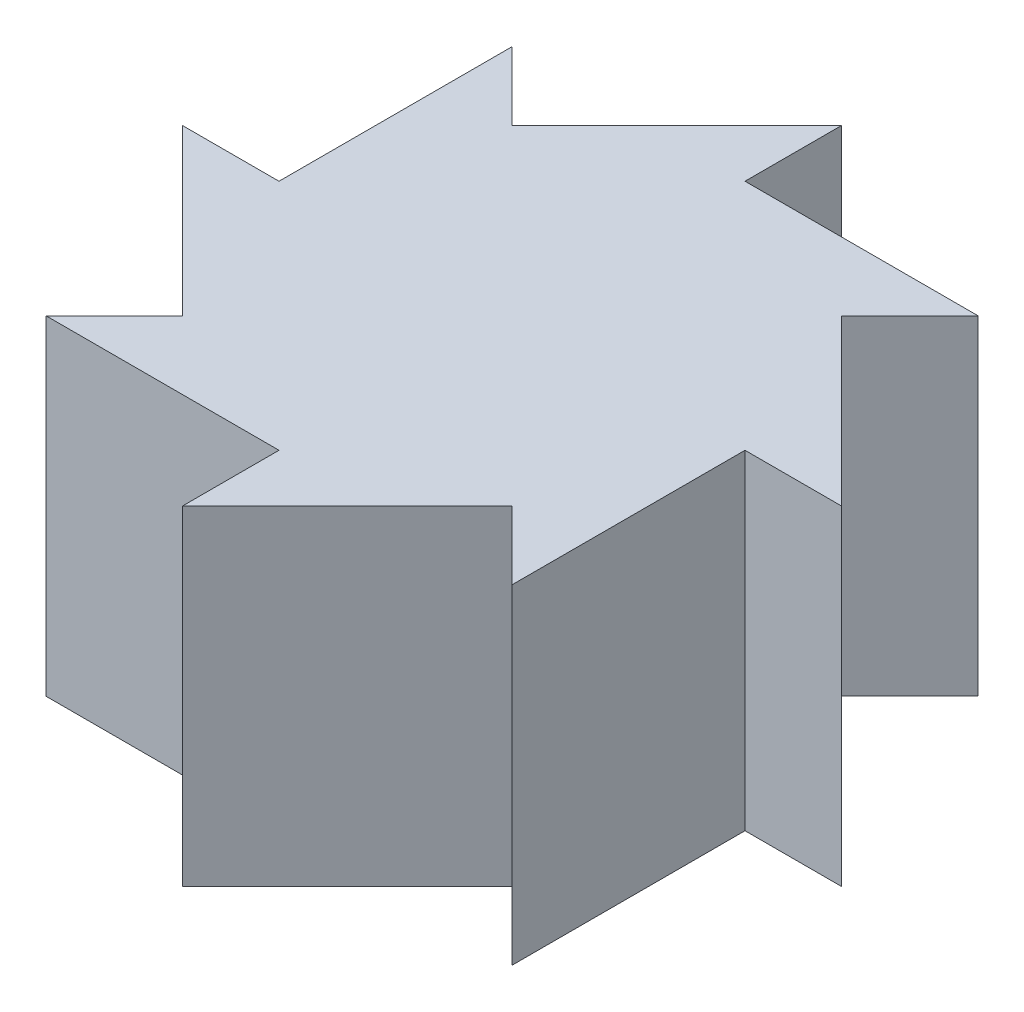
ISO-10303-21;
HEADER;
FILE_DESCRIPTION(('STEP AP214'),'2;1');
FILE_NAME('part.step','',(''),(''),'','','');
FILE_SCHEMA(('AUTOMOTIVE_DESIGN { 1 0 10303 214 1 1 1 1 }'));
ENDSEC;
DATA;
#1=APPLICATION_CONTEXT('core data for automotive mechanical design processes');
#2=APPLICATION_PROTOCOL_DEFINITION('international standard','automotive_design',2000,#1);
#3=PRODUCT_CONTEXT('',#1,'mechanical');
#4=PRODUCT('Part','Part','',(#3));
#5=PRODUCT_RELATED_PRODUCT_CATEGORY('part','',(#4));
#6=PRODUCT_DEFINITION_FORMATION('','',#4);
#7=PRODUCT_DEFINITION_CONTEXT('part definition',#1,'design');
#8=PRODUCT_DEFINITION('design','',#6,#7);
#9=PRODUCT_DEFINITION_SHAPE('','',#8);
#10=(LENGTH_UNIT() NAMED_UNIT(*) SI_UNIT(.MILLI.,.METRE.));
#11=(NAMED_UNIT(*) PLANE_ANGLE_UNIT() SI_UNIT($,.RADIAN.));
#12=(NAMED_UNIT(*) SI_UNIT($,.STERADIAN.) SOLID_ANGLE_UNIT());
#13=UNCERTAINTY_MEASURE_WITH_UNIT(LENGTH_MEASURE(1.E-05),#10,'distance_accuracy_value','');
#14=(GEOMETRIC_REPRESENTATION_CONTEXT(3) GLOBAL_UNCERTAINTY_ASSIGNED_CONTEXT((#13)) GLOBAL_UNIT_ASSIGNED_CONTEXT((#10,
#11,#12)) REPRESENTATION_CONTEXT('',''));
#15=CARTESIAN_POINT('',(0.,0.,0.));
#16=DIRECTION('',(0.,0.,1.));
#17=DIRECTION('',(1.,0.,0.));
#18=AXIS2_PLACEMENT_3D('',#15,#16,#17);
#19=CARTESIAN_POINT('',(0.,5.,0.));
#20=DIRECTION('',(0.,1.,0.));
#21=DIRECTION('',(0.,0.,1.));
#22=AXIS2_PLACEMENT_3D('',#19,#20,#21);
#23=PLANE('',#22);
#24=DIRECTION('',(0.707106781186556,0.,0.707106781186539));
#25=VECTOR('',#24,1.);
#26=CARTESIAN_POINT('',(2.5,5.,-2.50000000000006));
#27=LINE('',#26,#25);
#28=CARTESIAN_POINT('',(2.5,5.,-2.50000000000006));
#29=VERTEX_POINT('',#28);
#30=CARTESIAN_POINT('',(5.,5.,0.));
#31=VERTEX_POINT('',#30);
#32=EDGE_CURVE('E151',#29,#31,#27,.T.);
#33=ORIENTED_EDGE('',*,*,#32,.F.);
#34=DIRECTION('',(-0.707106781186539,0.,0.707106781186556));
#35=VECTOR('',#34,1.);
#36=CARTESIAN_POINT('',(3.53553390593269,5.,-3.53553390593278));
#37=LINE('',#36,#35);
#38=CARTESIAN_POINT('',(3.53553390593269,5.,-3.53553390593278));
#39=VERTEX_POINT('',#38);
#40=EDGE_CURVE('E157',#39,#29,#37,.T.);
#41=ORIENTED_EDGE('',*,*,#40,.F.);
#42=DIRECTION('',(1.,0.,0.));
#43=VECTOR('',#42,1.);
#44=CARTESIAN_POINT('',(0.,5.,-3.53553390593278));
#45=LINE('',#44,#43);
#46=CARTESIAN_POINT('',(0.,5.,-3.53553390593278));
#47=VERTEX_POINT('',#46);
#48=EDGE_CURVE('E270',#47,#39,#45,.T.);
#49=ORIENTED_EDGE('',*,*,#48,.F.);
#50=DIRECTION('',(0.,0.,1.));
#51=VECTOR('',#50,1.);
#52=CARTESIAN_POINT('',(0.,5.,-5.));
#53=LINE('',#52,#51);
#54=CARTESIAN_POINT('',(0.,5.,-5.));
#55=VERTEX_POINT('',#54);
#56=EDGE_CURVE('E264',#55,#47,#53,.T.);
#57=ORIENTED_EDGE('',*,*,#56,.F.);
#58=DIRECTION('',(0.707106781186546,0.,-0.707106781186549));
#59=VECTOR('',#58,1.);
#60=CARTESIAN_POINT('',(-2.50000000000003,5.,-2.50000000000003));
#61=LINE('',#60,#59);
#62=CARTESIAN_POINT('',(-2.50000000000003,5.,-2.50000000000003));
#63=VERTEX_POINT('',#62);
#64=EDGE_CURVE('E255',#63,#55,#61,.T.);
#65=ORIENTED_EDGE('',*,*,#64,.F.);
#66=DIRECTION('',(0.707106781186549,0.,0.707106781186547));
#67=VECTOR('',#66,1.);
#68=CARTESIAN_POINT('',(-3.53553390593274,5.,-3.53553390593273));
#69=LINE('',#68,#67);
#70=CARTESIAN_POINT('',(-3.53553390593274,5.,-3.53553390593273));
#71=VERTEX_POINT('',#70);
#72=EDGE_CURVE('E244',#71,#63,#69,.T.);
#73=ORIENTED_EDGE('',*,*,#72,.F.);
#74=DIRECTION('',(0.,0.,-1.));
#75=VECTOR('',#74,1.);
#76=CARTESIAN_POINT('',(-3.53553390593278,5.,0.));
#77=LINE('',#76,#75);
#78=CARTESIAN_POINT('',(-3.53553390593278,5.,0.));
#79=VERTEX_POINT('',#78);
#80=EDGE_CURVE('E242',#79,#71,#77,.T.);
#81=ORIENTED_EDGE('',*,*,#80,.F.);
#82=DIRECTION('',(1.,0.,0.));
#83=VECTOR('',#82,1.);
#84=CARTESIAN_POINT('',(-5.,5.,0.));
#85=LINE('',#84,#83);
#86=CARTESIAN_POINT('',(-5.,5.,0.));
#87=VERTEX_POINT('',#86);
#88=EDGE_CURVE('E240',#87,#79,#85,.T.);
#89=ORIENTED_EDGE('',*,*,#88,.F.);
#90=DIRECTION('',(-0.707106781186551,0.,-0.707106781186544));
#91=VECTOR('',#90,1.);
#92=CARTESIAN_POINT('',(-2.50000000000002,5.,2.50000000000004));
#93=LINE('',#92,#91);
#94=CARTESIAN_POINT('',(-2.50000000000002,5.,2.50000000000004));
#95=VERTEX_POINT('',#94);
#96=EDGE_CURVE('E226',#95,#87,#93,.T.);
#97=ORIENTED_EDGE('',*,*,#96,.F.);
#98=DIRECTION('',(0.707106781186544,0.,-0.707106781186551));
#99=VECTOR('',#98,1.);
#100=CARTESIAN_POINT('',(-3.53553390593272,5.,3.53553390593276));
#101=LINE('',#100,#99);
#102=CARTESIAN_POINT('',(-3.53553390593272,5.,3.53553390593276));
#103=VERTEX_POINT('',#102);
#104=EDGE_CURVE('E224',#103,#95,#101,.T.);
#105=ORIENTED_EDGE('',*,*,#104,.F.);
#106=DIRECTION('',(-1.,0.,0.));
#107=VECTOR('',#106,1.);
#108=CARTESIAN_POINT('',(0.,5.,3.53553390593278));
#109=LINE('',#108,#107);
#110=CARTESIAN_POINT('',(0.,5.,3.53553390593278));
#111=VERTEX_POINT('',#110);
#112=EDGE_CURVE('E210',#111,#103,#109,.T.);
#113=ORIENTED_EDGE('',*,*,#112,.F.);
#114=DIRECTION('',(0.,0.,-1.));
#115=VECTOR('',#114,1.);
#116=CARTESIAN_POINT('',(0.,5.,5.));
#117=LINE('',#116,#115);
#118=CARTESIAN_POINT('',(0.,5.,5.));
#119=VERTEX_POINT('',#118);
#120=EDGE_CURVE('E208',#119,#111,#117,.T.);
#121=ORIENTED_EDGE('',*,*,#120,.F.);
#122=DIRECTION('',(-0.707106781186541,0.,0.707106781186554));
#123=VECTOR('',#122,1.);
#124=CARTESIAN_POINT('',(2.50000000000005,5.,2.50000000000001));
#125=LINE('',#124,#123);
#126=CARTESIAN_POINT('',(2.50000000000005,5.,2.50000000000001));
#127=VERTEX_POINT('',#126);
#128=EDGE_CURVE('E194',#127,#119,#125,.T.);
#129=ORIENTED_EDGE('',*,*,#128,.F.);
#130=DIRECTION('',(-0.707106781186553,0.,-0.707106781186542));
#131=VECTOR('',#130,1.);
#132=CARTESIAN_POINT('',(3.53553390593277,5.,3.53553390593271));
#133=LINE('',#132,#131);
#134=CARTESIAN_POINT('',(3.53553390593277,5.,3.53553390593271));
#135=VERTEX_POINT('',#134);
#136=EDGE_CURVE('E192',#135,#127,#133,.T.);
#137=ORIENTED_EDGE('',*,*,#136,.F.);
#138=DIRECTION('',(0.,0.,1.));
#139=VECTOR('',#138,1.);
#140=CARTESIAN_POINT('',(3.53553390593278,5.,0.));
#141=LINE('',#140,#139);
#142=CARTESIAN_POINT('',(3.53553390593278,5.,0.));
#143=VERTEX_POINT('',#142);
#144=EDGE_CURVE('E179',#143,#135,#141,.T.);
#145=ORIENTED_EDGE('',*,*,#144,.F.);
#146=DIRECTION('',(-1.,0.,0.));
#147=VECTOR('',#146,1.);
#148=CARTESIAN_POINT('',(5.,5.,0.));
#149=LINE('',#148,#147);
#150=EDGE_CURVE('E168',#31,#143,#149,.T.);
#151=ORIENTED_EDGE('',*,*,#150,.F.);
#152=EDGE_LOOP('',(#33,#41,#49,#57,#65,#73,#81,#89,#97,#105,#113,#121,#129,#137,#145,#151));
#153=FACE_BOUND('',#152,.T.);
#154=ADVANCED_FACE('F35',(#153),#23,.T.);
#155=CARTESIAN_POINT('',(0.,0.,0.));
#156=DIRECTION('',(0.,1.,0.));
#157=DIRECTION('',(0.,0.,1.));
#158=AXIS2_PLACEMENT_3D('',#155,#156,#157);
#159=PLANE('',#158);
#160=DIRECTION('',(-0.707106781186539,0.,0.707106781186556));
#161=VECTOR('',#160,1.);
#162=CARTESIAN_POINT('',(3.53553390593269,0.,-3.53553390593278));
#163=LINE('',#162,#161);
#164=CARTESIAN_POINT('',(3.53553390593269,0.,-3.53553390593278));
#165=VERTEX_POINT('',#164);
#166=CARTESIAN_POINT('',(2.5,0.,-2.50000000000006));
#167=VERTEX_POINT('',#166);
#168=EDGE_CURVE('E158',#165,#167,#163,.T.);
#169=ORIENTED_EDGE('',*,*,#168,.T.);
#170=DIRECTION('',(0.707106781186556,0.,0.707106781186539));
#171=VECTOR('',#170,1.);
#172=CARTESIAN_POINT('',(2.5,0.,-2.50000000000006));
#173=LINE('',#172,#171);
#174=CARTESIAN_POINT('',(5.,0.,-1.23165366794353E-13));
#175=VERTEX_POINT('',#174);
#176=EDGE_CURVE('E154',#167,#175,#173,.T.);
#177=ORIENTED_EDGE('',*,*,#176,.T.);
#178=DIRECTION('',(-1.,0.,0.));
#179=VECTOR('',#178,1.);
#180=CARTESIAN_POINT('',(5.,0.,0.));
#181=LINE('',#180,#179);
#182=CARTESIAN_POINT('',(3.53553390593278,0.,0.));
#183=VERTEX_POINT('',#182);
#184=EDGE_CURVE('E178',#175,#183,#181,.T.);
#185=ORIENTED_EDGE('',*,*,#184,.T.);
#186=DIRECTION('',(0.,0.,1.));
#187=VECTOR('',#186,1.);
#188=CARTESIAN_POINT('',(3.53553390593278,0.,0.));
#189=LINE('',#188,#187);
#190=CARTESIAN_POINT('',(3.53553390593282,0.,3.53553390593266));
#191=VERTEX_POINT('',#190);
#192=EDGE_CURVE('E171',#183,#191,#189,.T.);
#193=ORIENTED_EDGE('',*,*,#192,.T.);
#194=DIRECTION('',(-0.707106781186553,0.,-0.707106781186542));
#195=VECTOR('',#194,1.);
#196=CARTESIAN_POINT('',(3.53553390593277,0.,3.53553390593271));
#197=LINE('',#196,#195);
#198=CARTESIAN_POINT('',(2.50000000000005,0.,2.50000000000001));
#199=VERTEX_POINT('',#198);
#200=EDGE_CURVE('E193',#191,#199,#197,.T.);
#201=ORIENTED_EDGE('',*,*,#200,.T.);
#202=DIRECTION('',(-0.707106781186541,0.,0.707106781186554));
#203=VECTOR('',#202,1.);
#204=CARTESIAN_POINT('',(2.50000000000005,0.,2.50000000000001));
#205=LINE('',#204,#203);
#206=CARTESIAN_POINT('',(1.05818132034585E-13,0.,5.));
#207=VERTEX_POINT('',#206);
#208=EDGE_CURVE('E189',#199,#207,#205,.T.);
#209=ORIENTED_EDGE('',*,*,#208,.T.);
#210=DIRECTION('',(0.,0.,-1.));
#211=VECTOR('',#210,1.);
#212=CARTESIAN_POINT('',(0.,0.,5.));
#213=LINE('',#212,#211);
#214=CARTESIAN_POINT('',(0.,0.,3.53553390593278));
#215=VERTEX_POINT('',#214);
#216=EDGE_CURVE('E209',#207,#215,#213,.T.);
#217=ORIENTED_EDGE('',*,*,#216,.T.);
#218=DIRECTION('',(-1.,0.,0.));
#219=VECTOR('',#218,1.);
#220=CARTESIAN_POINT('',(0.,0.,3.53553390593278));
#221=LINE('',#220,#219);
#222=CARTESIAN_POINT('',(-3.53553390593269,0.,3.53553390593278));
#223=VERTEX_POINT('',#222);
#224=EDGE_CURVE('E205',#215,#223,#221,.T.);
#225=ORIENTED_EDGE('',*,*,#224,.T.);
#226=DIRECTION('',(0.707106781186544,0.,-0.707106781186551));
#227=VECTOR('',#226,1.);
#228=CARTESIAN_POINT('',(-3.53553390593272,0.,3.53553390593276));
#229=LINE('',#228,#227);
#230=CARTESIAN_POINT('',(-2.50000000000002,0.,2.50000000000004));
#231=VERTEX_POINT('',#230);
#232=EDGE_CURVE('E225',#223,#231,#229,.T.);
#233=ORIENTED_EDGE('',*,*,#232,.T.);
#234=DIRECTION('',(-0.707106781186551,0.,-0.707106781186544));
#235=VECTOR('',#234,1.);
#236=CARTESIAN_POINT('',(-2.50000000000002,0.,2.50000000000004));
#237=LINE('',#236,#235);
#238=CARTESIAN_POINT('',(-5.,0.,0.));
#239=VERTEX_POINT('',#238);
#240=EDGE_CURVE('E221',#231,#239,#237,.T.);
#241=ORIENTED_EDGE('',*,*,#240,.T.);
#242=DIRECTION('',(1.,0.,0.));
#243=VECTOR('',#242,1.);
#244=CARTESIAN_POINT('',(-5.,0.,0.));
#245=LINE('',#244,#243);
#246=CARTESIAN_POINT('',(-3.53553390593278,0.,0.));
#247=VERTEX_POINT('',#246);
#248=EDGE_CURVE('E241',#239,#247,#245,.T.);
#249=ORIENTED_EDGE('',*,*,#248,.T.);
#250=DIRECTION('',(0.,0.,-1.));
#251=VECTOR('',#250,1.);
#252=CARTESIAN_POINT('',(-3.53553390593278,0.,0.));
#253=LINE('',#252,#251);
#254=CARTESIAN_POINT('',(-3.53553390593279,0.,-3.53553390593268));
#255=VERTEX_POINT('',#254);
#256=EDGE_CURVE('E237',#247,#255,#253,.T.);
#257=ORIENTED_EDGE('',*,*,#256,.T.);
#258=DIRECTION('',(0.707106781186549,0.,0.707106781186547));
#259=VECTOR('',#258,1.);
#260=CARTESIAN_POINT('',(-3.53553390593274,0.,-3.53553390593273));
#261=LINE('',#260,#259);
#262=CARTESIAN_POINT('',(-2.50000000000003,0.,-2.50000000000003));
#263=VERTEX_POINT('',#262);
#264=EDGE_CURVE('E251',#255,#263,#261,.T.);
#265=ORIENTED_EDGE('',*,*,#264,.T.);
#266=DIRECTION('',(0.707106781186546,0.,-0.707106781186549));
#267=VECTOR('',#266,1.);
#268=CARTESIAN_POINT('',(-2.50000000000003,0.,-2.50000000000003));
#269=LINE('',#268,#267);
#270=CARTESIAN_POINT('',(0.,0.,-5.));
#271=VERTEX_POINT('',#270);
#272=EDGE_CURVE('E254',#263,#271,#269,.T.);
#273=ORIENTED_EDGE('',*,*,#272,.T.);
#274=DIRECTION('',(0.,0.,1.));
#275=VECTOR('',#274,1.);
#276=CARTESIAN_POINT('',(0.,0.,-5.));
#277=LINE('',#276,#275);
#278=CARTESIAN_POINT('',(0.,0.,-3.53553390593278));
#279=VERTEX_POINT('',#278);
#280=EDGE_CURVE('E267',#271,#279,#277,.T.);
#281=ORIENTED_EDGE('',*,*,#280,.T.);
#282=DIRECTION('',(1.,0.,0.));
#283=VECTOR('',#282,1.);
#284=CARTESIAN_POINT('',(0.,0.,-3.53553390593278));
#285=LINE('',#284,#283);
#286=EDGE_CURVE('E52',#279,#165,#285,.T.);
#287=ORIENTED_EDGE('',*,*,#286,.T.);
#288=EDGE_LOOP('',(#169,#177,#185,#193,#201,#209,#217,#225,#233,#241,#249,#257,#265,#273,#281,#287));
#289=FACE_BOUND('',#288,.T.);
#290=ADVANCED_FACE('F37',(#289),#159,.F.);
#291=CARTESIAN_POINT('',(0.,0.,-3.53553390593278));
#292=DIRECTION('',(0.,0.,1.));
#293=DIRECTION('',(1.,0.,0.));
#294=AXIS2_PLACEMENT_3D('',#291,#292,#293);
#295=PLANE('',#294);
#296=ORIENTED_EDGE('',*,*,#48,.T.);
#297=DIRECTION('',(0.,1.,0.));
#298=VECTOR('',#297,1.);
#299=CARTESIAN_POINT('',(3.53553390593269,0.,-3.53553390593278));
#300=LINE('',#299,#298);
#301=EDGE_CURVE('E11',#165,#39,#300,.T.);
#302=ORIENTED_EDGE('',*,*,#301,.F.);
#303=ORIENTED_EDGE('',*,*,#286,.F.);
#304=DIRECTION('',(0.,1.,0.));
#305=VECTOR('',#304,1.);
#306=CARTESIAN_POINT('',(0.,0.,-3.53553390593278));
#307=LINE('',#306,#305);
#308=EDGE_CURVE('E44',#279,#47,#307,.T.);
#309=ORIENTED_EDGE('',*,*,#308,.T.);
#310=EDGE_LOOP('',(#296,#302,#303,#309));
#311=FACE_BOUND('',#310,.T.);
#312=ADVANCED_FACE('F282',(#311),#295,.F.);
#313=CARTESIAN_POINT('',(0.,0.,-5.));
#314=DIRECTION('',(-1.,0.,0.));
#315=DIRECTION('',(0.,0.,1.));
#316=AXIS2_PLACEMENT_3D('',#313,#314,#315);
#317=PLANE('',#316);
#318=ORIENTED_EDGE('',*,*,#56,.T.);
#319=ORIENTED_EDGE('',*,*,#308,.F.);
#320=ORIENTED_EDGE('',*,*,#280,.F.);
#321=DIRECTION('',(0.,1.,0.));
#322=VECTOR('',#321,1.);
#323=CARTESIAN_POINT('',(0.,0.,-5.));
#324=LINE('',#323,#322);
#325=EDGE_CURVE('E39',#271,#55,#324,.T.);
#326=ORIENTED_EDGE('',*,*,#325,.T.);
#327=EDGE_LOOP('',(#318,#319,#320,#326));
#328=FACE_BOUND('',#327,.T.);
#329=ADVANCED_FACE('F277',(#328),#317,.F.);
#330=CARTESIAN_POINT('',(-2.50000000000003,0.,-2.50000000000003));
#331=DIRECTION('',(0.707106781186549,0.,0.707106781186546));
#332=DIRECTION('',(0.707106781186546,0.,-0.707106781186549));
#333=AXIS2_PLACEMENT_3D('',#330,#331,#332);
#334=PLANE('',#333);
#335=ORIENTED_EDGE('',*,*,#64,.T.);
#336=ORIENTED_EDGE('',*,*,#325,.F.);
#337=ORIENTED_EDGE('',*,*,#272,.F.);
#338=DIRECTION('',(0.,1.,0.));
#339=VECTOR('',#338,1.);
#340=CARTESIAN_POINT('',(-2.50000000000003,0.,-2.50000000000003));
#341=LINE('',#340,#339);
#342=EDGE_CURVE('E262',#263,#63,#341,.T.);
#343=ORIENTED_EDGE('',*,*,#342,.T.);
#344=EDGE_LOOP('',(#335,#336,#337,#343));
#345=FACE_BOUND('',#344,.T.);
#346=ADVANCED_FACE('F285',(#345),#334,.F.);
#347=CARTESIAN_POINT('',(-3.53553390593274,0.,-3.53553390593273));
#348=DIRECTION('',(-0.707106781186547,0.,0.707106781186549));
#349=DIRECTION('',(0.707106781186549,0.,0.707106781186547));
#350=AXIS2_PLACEMENT_3D('',#347,#348,#349);
#351=PLANE('',#350);
#352=ORIENTED_EDGE('',*,*,#72,.T.);
#353=ORIENTED_EDGE('',*,*,#342,.F.);
#354=ORIENTED_EDGE('',*,*,#264,.F.);
#355=DIRECTION('',(0.,1.,0.));
#356=VECTOR('',#355,1.);
#357=CARTESIAN_POINT('',(-3.53553390593274,0.,-3.53553390593273));
#358=LINE('',#357,#356);
#359=EDGE_CURVE('E258',#255,#71,#358,.T.);
#360=ORIENTED_EDGE('',*,*,#359,.T.);
#361=EDGE_LOOP('',(#352,#353,#354,#360));
#362=FACE_BOUND('',#361,.T.);
#363=ADVANCED_FACE('F287',(#362),#351,.F.);
#364=CARTESIAN_POINT('',(-3.53553390593278,0.,0.));
#365=DIRECTION('',(1.,0.,0.));
#366=DIRECTION('',(0.,0.,-1.));
#367=AXIS2_PLACEMENT_3D('',#364,#365,#366);
#368=PLANE('',#367);
#369=ORIENTED_EDGE('',*,*,#80,.T.);
#370=ORIENTED_EDGE('',*,*,#359,.F.);
#371=ORIENTED_EDGE('',*,*,#256,.F.);
#372=DIRECTION('',(0.,1.,0.));
#373=VECTOR('',#372,1.);
#374=CARTESIAN_POINT('',(-3.53553390593278,0.,0.));
#375=LINE('',#374,#373);
#376=EDGE_CURVE('E238',#247,#79,#375,.T.);
#377=ORIENTED_EDGE('',*,*,#376,.T.);
#378=EDGE_LOOP('',(#369,#370,#371,#377));
#379=FACE_BOUND('',#378,.T.);
#380=ADVANCED_FACE('F292',(#379),#368,.F.);
#381=CARTESIAN_POINT('',(-5.,0.,0.));
#382=DIRECTION('',(0.,0.,1.));
#383=DIRECTION('',(1.,0.,0.));
#384=AXIS2_PLACEMENT_3D('',#381,#382,#383);
#385=PLANE('',#384);
#386=ORIENTED_EDGE('',*,*,#88,.T.);
#387=ORIENTED_EDGE('',*,*,#376,.F.);
#388=ORIENTED_EDGE('',*,*,#248,.F.);
#389=DIRECTION('',(0.,1.,0.));
#390=VECTOR('',#389,1.);
#391=CARTESIAN_POINT('',(-5.,0.,0.));
#392=LINE('',#391,#390);
#393=EDGE_CURVE('E228',#239,#87,#392,.T.);
#394=ORIENTED_EDGE('',*,*,#393,.T.);
#395=EDGE_LOOP('',(#386,#387,#388,#394));
#396=FACE_BOUND('',#395,.T.);
#397=ADVANCED_FACE('F296',(#396),#385,.F.);
#398=CARTESIAN_POINT('',(-2.50000000000002,0.,2.50000000000004));
#399=DIRECTION('',(0.707106781186544,0.,-0.707106781186551));
#400=DIRECTION('',(-0.707106781186551,0.,-0.707106781186544));
#401=AXIS2_PLACEMENT_3D('',#398,#399,#400);
#402=PLANE('',#401);
#403=ORIENTED_EDGE('',*,*,#96,.T.);
#404=ORIENTED_EDGE('',*,*,#393,.F.);
#405=ORIENTED_EDGE('',*,*,#240,.F.);
#406=DIRECTION('',(0.,1.,0.));
#407=VECTOR('',#406,1.);
#408=CARTESIAN_POINT('',(-2.50000000000002,0.,2.50000000000004));
#409=LINE('',#408,#407);
#410=EDGE_CURVE('E222',#231,#95,#409,.T.);
#411=ORIENTED_EDGE('',*,*,#410,.T.);
#412=EDGE_LOOP('',(#403,#404,#405,#411));
#413=FACE_BOUND('',#412,.T.);
#414=ADVANCED_FACE('F299',(#413),#402,.F.);
#415=CARTESIAN_POINT('',(-3.53553390593272,0.,3.53553390593276));
#416=DIRECTION('',(0.707106781186551,0.,0.707106781186544));
#417=DIRECTION('',(0.707106781186544,0.,-0.707106781186551));
#418=AXIS2_PLACEMENT_3D('',#415,#416,#417);
#419=PLANE('',#418);
#420=ORIENTED_EDGE('',*,*,#104,.T.);
#421=ORIENTED_EDGE('',*,*,#410,.F.);
#422=ORIENTED_EDGE('',*,*,#232,.F.);
#423=DIRECTION('',(0.,1.,0.));
#424=VECTOR('',#423,1.);
#425=CARTESIAN_POINT('',(-3.53553390593272,0.,3.53553390593276));
#426=LINE('',#425,#424);
#427=EDGE_CURVE('E212',#223,#103,#426,.T.);
#428=ORIENTED_EDGE('',*,*,#427,.T.);
#429=EDGE_LOOP('',(#420,#421,#422,#428));
#430=FACE_BOUND('',#429,.T.);
#431=ADVANCED_FACE('F303',(#430),#419,.F.);
#432=CARTESIAN_POINT('',(0.,0.,3.53553390593278));
#433=DIRECTION('',(0.,0.,-1.));
#434=DIRECTION('',(-1.,0.,0.));
#435=AXIS2_PLACEMENT_3D('',#432,#433,#434);
#436=PLANE('',#435);
#437=ORIENTED_EDGE('',*,*,#112,.T.);
#438=ORIENTED_EDGE('',*,*,#427,.F.);
#439=ORIENTED_EDGE('',*,*,#224,.F.);
#440=DIRECTION('',(0.,1.,0.));
#441=VECTOR('',#440,1.);
#442=CARTESIAN_POINT('',(0.,0.,3.53553390593278));
#443=LINE('',#442,#441);
#444=EDGE_CURVE('E206',#215,#111,#443,.T.);
#445=ORIENTED_EDGE('',*,*,#444,.T.);
#446=EDGE_LOOP('',(#437,#438,#439,#445));
#447=FACE_BOUND('',#446,.T.);
#448=ADVANCED_FACE('F309',(#447),#436,.F.);
#449=CARTESIAN_POINT('',(0.,0.,5.));
#450=DIRECTION('',(1.,0.,0.));
#451=DIRECTION('',(0.,0.,-1.));
#452=AXIS2_PLACEMENT_3D('',#449,#450,#451);
#453=PLANE('',#452);
#454=ORIENTED_EDGE('',*,*,#120,.T.);
#455=ORIENTED_EDGE('',*,*,#444,.F.);
#456=ORIENTED_EDGE('',*,*,#216,.F.);
#457=DIRECTION('',(0.,1.,0.));
#458=VECTOR('',#457,1.);
#459=CARTESIAN_POINT('',(0.,0.,5.));
#460=LINE('',#459,#458);
#461=EDGE_CURVE('E196',#207,#119,#460,.T.);
#462=ORIENTED_EDGE('',*,*,#461,.T.);
#463=EDGE_LOOP('',(#454,#455,#456,#462));
#464=FACE_BOUND('',#463,.T.);
#465=ADVANCED_FACE('F312',(#464),#453,.F.);
#466=CARTESIAN_POINT('',(2.50000000000005,0.,2.50000000000001));
#467=DIRECTION('',(-0.707106781186554,0.,-0.707106781186541));
#468=DIRECTION('',(-0.707106781186541,0.,0.707106781186554));
#469=AXIS2_PLACEMENT_3D('',#466,#467,#468);
#470=PLANE('',#469);
#471=ORIENTED_EDGE('',*,*,#128,.T.);
#472=ORIENTED_EDGE('',*,*,#461,.F.);
#473=ORIENTED_EDGE('',*,*,#208,.F.);
#474=DIRECTION('',(0.,1.,0.));
#475=VECTOR('',#474,1.);
#476=CARTESIAN_POINT('',(2.50000000000005,0.,2.50000000000001));
#477=LINE('',#476,#475);
#478=EDGE_CURVE('E190',#199,#127,#477,.T.);
#479=ORIENTED_EDGE('',*,*,#478,.T.);
#480=EDGE_LOOP('',(#471,#472,#473,#479));
#481=FACE_BOUND('',#480,.T.);
#482=ADVANCED_FACE('F315',(#481),#470,.F.);
#483=CARTESIAN_POINT('',(3.53553390593277,0.,3.53553390593271));
#484=DIRECTION('',(0.707106781186542,0.,-0.707106781186553));
#485=DIRECTION('',(-0.707106781186553,0.,-0.707106781186542));
#486=AXIS2_PLACEMENT_3D('',#483,#484,#485);
#487=PLANE('',#486);
#488=ORIENTED_EDGE('',*,*,#136,.T.);
#489=ORIENTED_EDGE('',*,*,#478,.F.);
#490=ORIENTED_EDGE('',*,*,#200,.F.);
#491=DIRECTION('',(0.,1.,0.));
#492=VECTOR('',#491,1.);
#493=CARTESIAN_POINT('',(3.53553390593277,0.,3.53553390593271));
#494=LINE('',#493,#492);
#495=EDGE_CURVE('E181',#191,#135,#494,.T.);
#496=ORIENTED_EDGE('',*,*,#495,.T.);
#497=EDGE_LOOP('',(#488,#489,#490,#496));
#498=FACE_BOUND('',#497,.T.);
#499=ADVANCED_FACE('F319',(#498),#487,.F.);
#500=CARTESIAN_POINT('',(3.53553390593278,0.,0.));
#501=DIRECTION('',(-1.,0.,0.));
#502=DIRECTION('',(0.,0.,1.));
#503=AXIS2_PLACEMENT_3D('',#500,#501,#502);
#504=PLANE('',#503);
#505=ORIENTED_EDGE('',*,*,#144,.T.);
#506=ORIENTED_EDGE('',*,*,#495,.F.);
#507=ORIENTED_EDGE('',*,*,#192,.F.);
#508=DIRECTION('',(0.,1.,0.));
#509=VECTOR('',#508,1.);
#510=CARTESIAN_POINT('',(3.53553390593278,0.,0.));
#511=LINE('',#510,#509);
#512=EDGE_CURVE('E176',#183,#143,#511,.T.);
#513=ORIENTED_EDGE('',*,*,#512,.T.);
#514=EDGE_LOOP('',(#505,#506,#507,#513));
#515=FACE_BOUND('',#514,.T.);
#516=ADVANCED_FACE('F322',(#515),#504,.F.);
#517=CARTESIAN_POINT('',(5.,0.,0.));
#518=DIRECTION('',(0.,0.,-1.));
#519=DIRECTION('',(-1.,0.,0.));
#520=AXIS2_PLACEMENT_3D('',#517,#518,#519);
#521=PLANE('',#520);
#522=ORIENTED_EDGE('',*,*,#150,.T.);
#523=ORIENTED_EDGE('',*,*,#512,.F.);
#524=ORIENTED_EDGE('',*,*,#184,.F.);
#525=DIRECTION('',(0.,1.,0.));
#526=VECTOR('',#525,1.);
#527=CARTESIAN_POINT('',(5.,0.,0.));
#528=LINE('',#527,#526);
#529=EDGE_CURVE('E169',#175,#31,#528,.T.);
#530=ORIENTED_EDGE('',*,*,#529,.T.);
#531=EDGE_LOOP('',(#522,#523,#524,#530));
#532=FACE_BOUND('',#531,.T.);
#533=ADVANCED_FACE('F325',(#532),#521,.F.);
#534=CARTESIAN_POINT('',(2.5,0.,-2.50000000000006));
#535=DIRECTION('',(-0.707106781186539,0.,0.707106781186556));
#536=DIRECTION('',(0.707106781186556,0.,0.707106781186539));
#537=AXIS2_PLACEMENT_3D('',#534,#535,#536);
#538=PLANE('',#537);
#539=ORIENTED_EDGE('',*,*,#32,.T.);
#540=ORIENTED_EDGE('',*,*,#529,.F.);
#541=ORIENTED_EDGE('',*,*,#176,.F.);
#542=DIRECTION('',(0.,1.,0.));
#543=VECTOR('',#542,1.);
#544=CARTESIAN_POINT('',(2.5,0.,-2.50000000000006));
#545=LINE('',#544,#543);
#546=EDGE_CURVE('E147',#167,#29,#545,.T.);
#547=ORIENTED_EDGE('',*,*,#546,.T.);
#548=EDGE_LOOP('',(#539,#540,#541,#547));
#549=FACE_BOUND('',#548,.T.);
#550=ADVANCED_FACE('F149',(#549),#538,.F.);
#551=CARTESIAN_POINT('',(3.53553390593269,0.,-3.53553390593278));
#552=DIRECTION('',(-0.707106781186556,0.,-0.707106781186539));
#553=DIRECTION('',(-0.707106781186539,0.,0.707106781186556));
#554=AXIS2_PLACEMENT_3D('',#551,#552,#553);
#555=PLANE('',#554);
#556=ORIENTED_EDGE('',*,*,#40,.T.);
#557=ORIENTED_EDGE('',*,*,#546,.F.);
#558=ORIENTED_EDGE('',*,*,#168,.F.);
#559=ORIENTED_EDGE('',*,*,#301,.T.);
#560=EDGE_LOOP('',(#556,#557,#558,#559));
#561=FACE_BOUND('',#560,.T.);
#562=ADVANCED_FACE('F161',(#561),#555,.F.);
#563=CLOSED_SHELL('',(#154,#290,#312,#329,#346,#363,#380,#397,#414,#431,#448,#465,#482,#499,
#516,#533,#550,#562));
#564=MANIFOLD_SOLID_BREP('B2',#563);
#565=ADVANCED_BREP_SHAPE_REPRESENTATION('',(#18,#564),#14);
#566=SHAPE_DEFINITION_REPRESENTATION(#9,#565);
ENDSEC;
END-ISO-10303-21;
